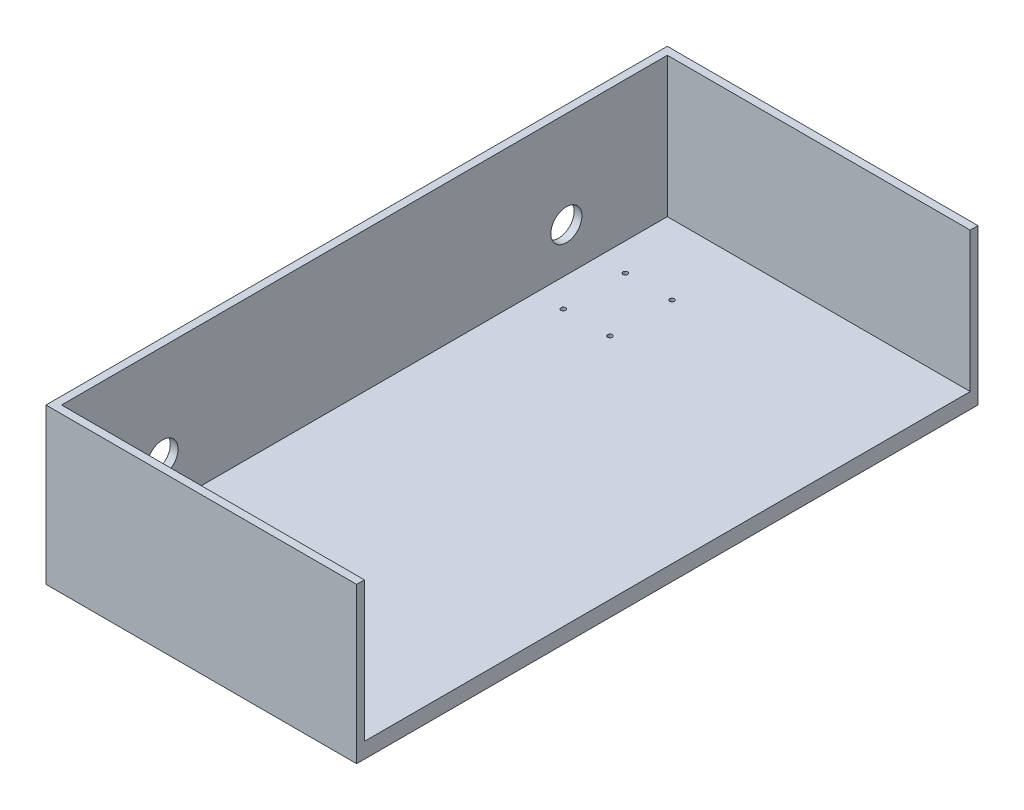
ISO-10303-21;
HEADER;
FILE_DESCRIPTION(('STEP AP214'),'2;1');
FILE_NAME('part.step','',(''),(''),'','','');
FILE_SCHEMA(('AUTOMOTIVE_DESIGN { 1 0 10303 214 1 1 1 1 }'));
ENDSEC;
DATA;
#1=APPLICATION_CONTEXT('core data for automotive mechanical design processes');
#2=APPLICATION_PROTOCOL_DEFINITION('international standard','automotive_design',2000,#1);
#3=PRODUCT_CONTEXT('',#1,'mechanical');
#4=PRODUCT('Part','Part','',(#3));
#5=PRODUCT_RELATED_PRODUCT_CATEGORY('part','',(#4));
#6=PRODUCT_DEFINITION_FORMATION('','',#4);
#7=PRODUCT_DEFINITION_CONTEXT('part definition',#1,'design');
#8=PRODUCT_DEFINITION('design','',#6,#7);
#9=PRODUCT_DEFINITION_SHAPE('','',#8);
#10=(LENGTH_UNIT() NAMED_UNIT(*) SI_UNIT(.MILLI.,.METRE.));
#11=(NAMED_UNIT(*) PLANE_ANGLE_UNIT() SI_UNIT($,.RADIAN.));
#12=(NAMED_UNIT(*) SI_UNIT($,.STERADIAN.) SOLID_ANGLE_UNIT());
#13=UNCERTAINTY_MEASURE_WITH_UNIT(LENGTH_MEASURE(1.E-05),#10,'distance_accuracy_value','');
#14=(GEOMETRIC_REPRESENTATION_CONTEXT(3) GLOBAL_UNCERTAINTY_ASSIGNED_CONTEXT((#13)) GLOBAL_UNIT_ASSIGNED_CONTEXT((#10,
#11,#12)) REPRESENTATION_CONTEXT('',''));
#15=CARTESIAN_POINT('',(0.,0.,0.));
#16=DIRECTION('',(0.,0.,1.));
#17=DIRECTION('',(1.,0.,0.));
#18=AXIS2_PLACEMENT_3D('',#15,#16,#17);
#19=CARTESIAN_POINT('',(0.,10.,0.));
#20=DIRECTION('',(0.,-1.,0.));
#21=DIRECTION('',(0.,0.,-1.));
#22=AXIS2_PLACEMENT_3D('',#19,#20,#21);
#23=PLANE('',#22);
#24=CARTESIAN_POINT('',(53.,10.,-350.));
#25=DIRECTION('',(0.,1.,0.));
#26=DIRECTION('',(0.,0.,1.));
#27=AXIS2_PLACEMENT_3D('',#24,#25,#26);
#28=CIRCLE('',#27,1.5);
#29=CARTESIAN_POINT('',(53.,10.,-348.5));
#30=VERTEX_POINT('',#29);
#31=EDGE_CURVE('E463',#30,#30,#28,.T.);
#32=ORIENTED_EDGE('',*,*,#31,.F.);
#33=EDGE_LOOP('',(#32));
#34=FACE_BOUND('',#33,.T.);
#35=CARTESIAN_POINT('',(53.,10.,-310.));
#36=DIRECTION('',(0.,1.,0.));
#37=DIRECTION('',(0.,0.,1.));
#38=AXIS2_PLACEMENT_3D('',#35,#36,#37);
#39=CIRCLE('',#38,1.5);
#40=CARTESIAN_POINT('',(53.,10.,-308.5));
#41=VERTEX_POINT('',#40);
#42=EDGE_CURVE('E474',#41,#41,#39,.T.);
#43=ORIENTED_EDGE('',*,*,#42,.F.);
#44=EDGE_LOOP('',(#43));
#45=FACE_BOUND('',#44,.T.);
#46=CARTESIAN_POINT('',(23.,10.,-310.));
#47=DIRECTION('',(0.,1.,0.));
#48=DIRECTION('',(0.,0.,1.));
#49=AXIS2_PLACEMENT_3D('',#46,#47,#48);
#50=CIRCLE('',#49,1.5);
#51=CARTESIAN_POINT('',(23.,10.,-308.5));
#52=VERTEX_POINT('',#51);
#53=EDGE_CURVE('E480',#52,#52,#50,.T.);
#54=ORIENTED_EDGE('',*,*,#53,.F.);
#55=EDGE_LOOP('',(#54));
#56=FACE_BOUND('',#55,.T.);
#57=CARTESIAN_POINT('',(23.,10.,-90.));
#58=DIRECTION('',(0.,1.,0.));
#59=DIRECTION('',(0.,0.,-1.));
#60=AXIS2_PLACEMENT_3D('',#57,#58,#59);
#61=CIRCLE('',#60,1.5);
#62=CARTESIAN_POINT('',(23.,10.,-91.5));
#63=VERTEX_POINT('',#62);
#64=EDGE_CURVE('E486',#63,#63,#61,.T.);
#65=ORIENTED_EDGE('',*,*,#64,.F.);
#66=EDGE_LOOP('',(#65));
#67=FACE_BOUND('',#66,.T.);
#68=CARTESIAN_POINT('',(53.,10.,-90.));
#69=DIRECTION('',(0.,1.,0.));
#70=DIRECTION('',(0.,0.,-1.));
#71=AXIS2_PLACEMENT_3D('',#68,#69,#70);
#72=CIRCLE('',#71,1.5);
#73=CARTESIAN_POINT('',(53.,10.,-91.5));
#74=VERTEX_POINT('',#73);
#75=EDGE_CURVE('E492',#74,#74,#72,.T.);
#76=ORIENTED_EDGE('',*,*,#75,.F.);
#77=EDGE_LOOP('',(#76));
#78=FACE_BOUND('',#77,.T.);
#79=CARTESIAN_POINT('',(53.,10.,-50.));
#80=DIRECTION('',(0.,1.,0.));
#81=DIRECTION('',(0.,0.,-1.));
#82=AXIS2_PLACEMENT_3D('',#79,#80,#81);
#83=CIRCLE('',#82,1.5);
#84=CARTESIAN_POINT('',(53.,10.,-51.5));
#85=VERTEX_POINT('',#84);
#86=EDGE_CURVE('E498',#85,#85,#83,.T.);
#87=ORIENTED_EDGE('',*,*,#86,.F.);
#88=EDGE_LOOP('',(#87));
#89=FACE_BOUND('',#88,.T.);
#90=CARTESIAN_POINT('',(23.,10.,-50.));
#91=DIRECTION('',(0.,1.,0.));
#92=DIRECTION('',(0.,0.,-1.));
#93=AXIS2_PLACEMENT_3D('',#90,#91,#92);
#94=CIRCLE('',#93,1.5);
#95=CARTESIAN_POINT('',(23.,10.,-51.5));
#96=VERTEX_POINT('',#95);
#97=EDGE_CURVE('E504',#96,#96,#94,.T.);
#98=ORIENTED_EDGE('',*,*,#97,.F.);
#99=EDGE_LOOP('',(#98));
#100=FACE_BOUND('',#99,.T.);
#101=CARTESIAN_POINT('',(23.,10.,-350.));
#102=DIRECTION('',(0.,1.,0.));
#103=DIRECTION('',(0.,0.,1.));
#104=AXIS2_PLACEMENT_3D('',#101,#102,#103);
#105=CIRCLE('',#104,1.5);
#106=CARTESIAN_POINT('',(23.,10.,-348.5));
#107=VERTEX_POINT('',#106);
#108=EDGE_CURVE('E462',#107,#107,#105,.T.);
#109=ORIENTED_EDGE('',*,*,#108,.F.);
#110=EDGE_LOOP('',(#109));
#111=FACE_BOUND('',#110,.T.);
#112=DIRECTION('',(1.,0.,0.));
#113=VECTOR('',#112,1.);
#114=CARTESIAN_POINT('',(5.,10.,-395.));
#115=LINE('',#114,#113);
#116=CARTESIAN_POINT('',(5.,10.,-395.));
#117=VERTEX_POINT('',#116);
#118=CARTESIAN_POINT('',(200.,10.,-395.));
#119=VERTEX_POINT('',#118);
#120=EDGE_CURVE('E48',#117,#119,#115,.T.);
#121=ORIENTED_EDGE('',*,*,#120,.F.);
#122=DIRECTION('',(0.,0.,-1.));
#123=VECTOR('',#122,1.);
#124=CARTESIAN_POINT('',(5.00000000000005,10.,-5.));
#125=LINE('',#124,#123);
#126=CARTESIAN_POINT('',(5.00000000000005,10.,-5.));
#127=VERTEX_POINT('',#126);
#128=EDGE_CURVE('E116',#127,#117,#125,.T.);
#129=ORIENTED_EDGE('',*,*,#128,.F.);
#130=DIRECTION('',(-1.,0.,0.));
#131=VECTOR('',#130,1.);
#132=CARTESIAN_POINT('',(5.00000000000005,10.,-5.));
#133=LINE('',#132,#131);
#134=CARTESIAN_POINT('',(200.,10.,-5.));
#135=VERTEX_POINT('',#134);
#136=EDGE_CURVE('E168',#135,#127,#133,.T.);
#137=ORIENTED_EDGE('',*,*,#136,.F.);
#138=DIRECTION('',(0.,0.,-1.));
#139=VECTOR('',#138,1.);
#140=CARTESIAN_POINT('',(200.,10.,0.));
#141=LINE('',#140,#139);
#142=EDGE_CURVE('E53',#135,#119,#141,.T.);
#143=ORIENTED_EDGE('',*,*,#142,.T.);
#144=EDGE_LOOP('',(#121,#129,#137,#143));
#145=FACE_BOUND('',#144,.T.);
#146=ADVANCED_FACE('F33',(#34,#45,#56,#67,#78,#89,#100,#111,#145),#23,.F.);
#147=CARTESIAN_POINT('',(0.,10.,0.));
#148=DIRECTION('',(1.,0.,0.));
#149=DIRECTION('',(0.,0.,-1.));
#150=AXIS2_PLACEMENT_3D('',#147,#148,#149);
#151=PLANE('',#150);
#152=CARTESIAN_POINT('',(0.,38.,-330.));
#153=DIRECTION('',(1.,0.,0.));
#154=DIRECTION('',(0.,0.,-1.));
#155=AXIS2_PLACEMENT_3D('',#152,#153,#154);
#156=CIRCLE('',#155,9.99999999999998);
#157=CARTESIAN_POINT('',(0.,38.,-340.));
#158=VERTEX_POINT('',#157);
#159=EDGE_CURVE('E512',#158,#158,#156,.F.);
#160=ORIENTED_EDGE('',*,*,#159,.F.);
#161=EDGE_LOOP('',(#160));
#162=FACE_BOUND('',#161,.T.);
#163=CARTESIAN_POINT('',(0.,38.,-70.));
#164=DIRECTION('',(1.,0.,0.));
#165=DIRECTION('',(0.,0.,-1.));
#166=AXIS2_PLACEMENT_3D('',#163,#164,#165);
#167=CIRCLE('',#166,10.);
#168=CARTESIAN_POINT('',(0.,38.,-80.));
#169=VERTEX_POINT('',#168);
#170=EDGE_CURVE('E169',#169,#169,#167,.F.);
#171=ORIENTED_EDGE('',*,*,#170,.F.);
#172=EDGE_LOOP('',(#171));
#173=FACE_BOUND('',#172,.T.);
#174=DIRECTION('',(0.,0.,1.));
#175=VECTOR('',#174,1.);
#176=CARTESIAN_POINT('',(0.,0.,0.));
#177=LINE('',#176,#175);
#178=CARTESIAN_POINT('',(0.,0.,-400.));
#179=VERTEX_POINT('',#178);
#180=CARTESIAN_POINT('',(0.,0.,0.));
#181=VERTEX_POINT('',#180);
#182=EDGE_CURVE('E119',#179,#181,#177,.T.);
#183=ORIENTED_EDGE('',*,*,#182,.T.);
#184=DIRECTION('',(0.,-1.,0.));
#185=VECTOR('',#184,1.);
#186=CARTESIAN_POINT('',(0.,10.,0.));
#187=LINE('',#186,#185);
#188=CARTESIAN_POINT('',(0.,100.,0.));
#189=VERTEX_POINT('',#188);
#190=EDGE_CURVE('E11',#189,#181,#187,.T.);
#191=ORIENTED_EDGE('',*,*,#190,.F.);
#192=DIRECTION('',(0.,0.,1.));
#193=VECTOR('',#192,1.);
#194=CARTESIAN_POINT('',(0.,100.,0.));
#195=LINE('',#194,#193);
#196=CARTESIAN_POINT('',(0.,100.,-400.));
#197=VERTEX_POINT('',#196);
#198=EDGE_CURVE('E156',#197,#189,#195,.T.);
#199=ORIENTED_EDGE('',*,*,#198,.F.);
#200=DIRECTION('',(0.,-1.,0.));
#201=VECTOR('',#200,1.);
#202=CARTESIAN_POINT('',(0.,10.,-400.));
#203=LINE('',#202,#201);
#204=EDGE_CURVE('E130',#197,#179,#203,.T.);
#205=ORIENTED_EDGE('',*,*,#204,.T.);
#206=EDGE_LOOP('',(#183,#191,#199,#205));
#207=FACE_BOUND('',#206,.T.);
#208=ADVANCED_FACE('F35',(#162,#173,#207),#151,.F.);
#209=CARTESIAN_POINT('',(0.,10.,0.));
#210=DIRECTION('',(0.,0.,-1.));
#211=DIRECTION('',(-1.,0.,0.));
#212=AXIS2_PLACEMENT_3D('',#209,#210,#211);
#213=PLANE('',#212);
#214=DIRECTION('',(1.,0.,0.));
#215=VECTOR('',#214,1.);
#216=CARTESIAN_POINT('',(0.,0.,0.));
#217=LINE('',#216,#215);
#218=CARTESIAN_POINT('',(200.,0.,0.));
#219=VERTEX_POINT('',#218);
#220=EDGE_CURVE('E123',#181,#219,#217,.T.);
#221=ORIENTED_EDGE('',*,*,#220,.T.);
#222=DIRECTION('',(0.,-1.,0.));
#223=VECTOR('',#222,1.);
#224=CARTESIAN_POINT('',(200.,10.,0.));
#225=LINE('',#224,#223);
#226=CARTESIAN_POINT('',(200.,100.,0.));
#227=VERTEX_POINT('',#226);
#228=EDGE_CURVE('E41',#227,#219,#225,.T.);
#229=ORIENTED_EDGE('',*,*,#228,.F.);
#230=DIRECTION('',(1.,0.,0.));
#231=VECTOR('',#230,1.);
#232=CARTESIAN_POINT('',(200.,100.,0.));
#233=LINE('',#232,#231);
#234=EDGE_CURVE('E157',#189,#227,#233,.T.);
#235=ORIENTED_EDGE('',*,*,#234,.F.);
#236=ORIENTED_EDGE('',*,*,#190,.T.);
#237=EDGE_LOOP('',(#221,#229,#235,#236));
#238=FACE_BOUND('',#237,.T.);
#239=ADVANCED_FACE('F186',(#238),#213,.F.);
#240=CARTESIAN_POINT('',(200.,10.,0.));
#241=DIRECTION('',(-1.,0.,0.));
#242=DIRECTION('',(0.,0.,1.));
#243=AXIS2_PLACEMENT_3D('',#240,#241,#242);
#244=PLANE('',#243);
#245=DIRECTION('',(0.,0.,-1.));
#246=VECTOR('',#245,1.);
#247=CARTESIAN_POINT('',(200.,0.,0.));
#248=LINE('',#247,#246);
#249=CARTESIAN_POINT('',(200.,0.,-400.));
#250=VERTEX_POINT('',#249);
#251=EDGE_CURVE('E134',#219,#250,#248,.T.);
#252=ORIENTED_EDGE('',*,*,#251,.T.);
#253=DIRECTION('',(0.,-1.,0.));
#254=VECTOR('',#253,1.);
#255=CARTESIAN_POINT('',(200.,10.,-400.));
#256=LINE('',#255,#254);
#257=CARTESIAN_POINT('',(200.,100.,-400.));
#258=VERTEX_POINT('',#257);
#259=EDGE_CURVE('E102',#258,#250,#256,.T.);
#260=ORIENTED_EDGE('',*,*,#259,.F.);
#261=DIRECTION('',(0.,0.,-1.));
#262=VECTOR('',#261,1.);
#263=CARTESIAN_POINT('',(200.,100.,-400.));
#264=LINE('',#263,#262);
#265=CARTESIAN_POINT('',(200.,100.,-395.));
#266=VERTEX_POINT('',#265);
#267=EDGE_CURVE('E96',#266,#258,#264,.T.);
#268=ORIENTED_EDGE('',*,*,#267,.F.);
#269=DIRECTION('',(0.,-1.,0.));
#270=VECTOR('',#269,1.);
#271=CARTESIAN_POINT('',(200.,100.,-395.));
#272=LINE('',#271,#270);
#273=EDGE_CURVE('E100',#266,#119,#272,.T.);
#274=ORIENTED_EDGE('',*,*,#273,.T.);
#275=ORIENTED_EDGE('',*,*,#142,.F.);
#276=DIRECTION('',(0.,-1.,0.));
#277=VECTOR('',#276,1.);
#278=CARTESIAN_POINT('',(200.,100.,-5.));
#279=LINE('',#278,#277);
#280=CARTESIAN_POINT('',(200.,100.,-5.));
#281=VERTEX_POINT('',#280);
#282=EDGE_CURVE('E120',#281,#135,#279,.T.);
#283=ORIENTED_EDGE('',*,*,#282,.F.);
#284=DIRECTION('',(0.,0.,-1.));
#285=VECTOR('',#284,1.);
#286=CARTESIAN_POINT('',(200.,100.,-5.));
#287=LINE('',#286,#285);
#288=EDGE_CURVE('E143',#227,#281,#287,.T.);
#289=ORIENTED_EDGE('',*,*,#288,.F.);
#290=ORIENTED_EDGE('',*,*,#228,.T.);
#291=EDGE_LOOP('',(#252,#260,#268,#274,#275,#283,#289,#290));
#292=FACE_BOUND('',#291,.T.);
#293=ADVANCED_FACE('F98',(#292),#244,.F.);
#294=CARTESIAN_POINT('',(0.,10.,-400.));
#295=DIRECTION('',(0.,0.,1.));
#296=DIRECTION('',(1.,0.,0.));
#297=AXIS2_PLACEMENT_3D('',#294,#295,#296);
#298=PLANE('',#297);
#299=DIRECTION('',(-1.,0.,0.));
#300=VECTOR('',#299,1.);
#301=CARTESIAN_POINT('',(0.,0.,-400.));
#302=LINE('',#301,#300);
#303=EDGE_CURVE('E131',#250,#179,#302,.T.);
#304=ORIENTED_EDGE('',*,*,#303,.T.);
#305=ORIENTED_EDGE('',*,*,#204,.F.);
#306=DIRECTION('',(-1.,0.,0.));
#307=VECTOR('',#306,1.);
#308=CARTESIAN_POINT('',(0.,100.,-400.));
#309=LINE('',#308,#307);
#310=EDGE_CURVE('E106',#258,#197,#309,.T.);
#311=ORIENTED_EDGE('',*,*,#310,.F.);
#312=ORIENTED_EDGE('',*,*,#259,.T.);
#313=EDGE_LOOP('',(#304,#305,#311,#312));
#314=FACE_BOUND('',#313,.T.);
#315=ADVANCED_FACE('F152',(#314),#298,.F.);
#316=CARTESIAN_POINT('',(0.,0.,0.));
#317=DIRECTION('',(0.,-1.,0.));
#318=DIRECTION('',(0.,0.,-1.));
#319=AXIS2_PLACEMENT_3D('',#316,#317,#318);
#320=PLANE('',#319);
#321=ORIENTED_EDGE('',*,*,#182,.F.);
#322=ORIENTED_EDGE('',*,*,#303,.F.);
#323=ORIENTED_EDGE('',*,*,#251,.F.);
#324=ORIENTED_EDGE('',*,*,#220,.F.);
#325=EDGE_LOOP('',(#321,#322,#323,#324));
#326=FACE_BOUND('',#325,.T.);
#327=ADVANCED_FACE('F150',(#326),#320,.T.);
#328=CARTESIAN_POINT('',(5.,100.,-395.));
#329=DIRECTION('',(0.,0.,-1.));
#330=DIRECTION('',(-1.,0.,0.));
#331=AXIS2_PLACEMENT_3D('',#328,#329,#330);
#332=PLANE('',#331);
#333=ORIENTED_EDGE('',*,*,#120,.T.);
#334=ORIENTED_EDGE('',*,*,#273,.F.);
#335=DIRECTION('',(1.,0.,0.));
#336=VECTOR('',#335,1.);
#337=CARTESIAN_POINT('',(5.,100.,-395.));
#338=LINE('',#337,#336);
#339=CARTESIAN_POINT('',(5.,100.,-395.));
#340=VERTEX_POINT('',#339);
#341=EDGE_CURVE('E107',#340,#266,#338,.T.);
#342=ORIENTED_EDGE('',*,*,#341,.F.);
#343=DIRECTION('',(0.,-1.,0.));
#344=VECTOR('',#343,1.);
#345=CARTESIAN_POINT('',(5.,100.,-395.));
#346=LINE('',#345,#344);
#347=EDGE_CURVE('E166',#340,#117,#346,.T.);
#348=ORIENTED_EDGE('',*,*,#347,.T.);
#349=EDGE_LOOP('',(#333,#334,#342,#348));
#350=FACE_BOUND('',#349,.T.);
#351=ADVANCED_FACE('F118',(#350),#332,.F.);
#352=CARTESIAN_POINT('',(5.00000000000005,100.,-5.));
#353=DIRECTION('',(0.,0.,1.));
#354=DIRECTION('',(1.,0.,0.));
#355=AXIS2_PLACEMENT_3D('',#352,#353,#354);
#356=PLANE('',#355);
#357=ORIENTED_EDGE('',*,*,#136,.T.);
#358=DIRECTION('',(0.,-1.,0.));
#359=VECTOR('',#358,1.);
#360=CARTESIAN_POINT('',(5.00000000000005,100.,-5.));
#361=LINE('',#360,#359);
#362=CARTESIAN_POINT('',(5.00000000000005,100.,-5.));
#363=VERTEX_POINT('',#362);
#364=EDGE_CURVE('E126',#363,#127,#361,.T.);
#365=ORIENTED_EDGE('',*,*,#364,.F.);
#366=DIRECTION('',(-1.,0.,0.));
#367=VECTOR('',#366,1.);
#368=CARTESIAN_POINT('',(5.00000000000005,100.,-5.));
#369=LINE('',#368,#367);
#370=EDGE_CURVE('E163',#281,#363,#369,.T.);
#371=ORIENTED_EDGE('',*,*,#370,.F.);
#372=ORIENTED_EDGE('',*,*,#282,.T.);
#373=EDGE_LOOP('',(#357,#365,#371,#372));
#374=FACE_BOUND('',#373,.T.);
#375=ADVANCED_FACE('F179',(#374),#356,.F.);
#376=CARTESIAN_POINT('',(5.00000000000005,100.,-5.));
#377=DIRECTION('',(-1.,0.,0.));
#378=DIRECTION('',(0.,0.,1.));
#379=AXIS2_PLACEMENT_3D('',#376,#377,#378);
#380=PLANE('',#379);
#381=CARTESIAN_POINT('',(5.00000000000001,38.,-330.));
#382=DIRECTION('',(1.,0.,0.));
#383=DIRECTION('',(0.,0.,-1.));
#384=AXIS2_PLACEMENT_3D('',#381,#382,#383);
#385=CIRCLE('',#384,9.99999999999998);
#386=CARTESIAN_POINT('',(5.00000000000001,38.,-340.));
#387=VERTEX_POINT('',#386);
#388=EDGE_CURVE('E508',#387,#387,#385,.T.);
#389=ORIENTED_EDGE('',*,*,#388,.F.);
#390=EDGE_LOOP('',(#389));
#391=FACE_BOUND('',#390,.T.);
#392=CARTESIAN_POINT('',(5.00000000000004,38.,-70.));
#393=DIRECTION('',(1.,0.,0.));
#394=DIRECTION('',(0.,0.,-1.));
#395=AXIS2_PLACEMENT_3D('',#392,#393,#394);
#396=CIRCLE('',#395,10.);
#397=CARTESIAN_POINT('',(5.00000000000004,38.,-80.));
#398=VERTEX_POINT('',#397);
#399=EDGE_CURVE('E515',#398,#398,#396,.T.);
#400=ORIENTED_EDGE('',*,*,#399,.F.);
#401=EDGE_LOOP('',(#400));
#402=FACE_BOUND('',#401,.T.);
#403=ORIENTED_EDGE('',*,*,#128,.T.);
#404=ORIENTED_EDGE('',*,*,#347,.F.);
#405=DIRECTION('',(0.,0.,-1.));
#406=VECTOR('',#405,1.);
#407=CARTESIAN_POINT('',(5.00000000000005,100.,-5.));
#408=LINE('',#407,#406);
#409=EDGE_CURVE('E112',#363,#340,#408,.T.);
#410=ORIENTED_EDGE('',*,*,#409,.F.);
#411=ORIENTED_EDGE('',*,*,#364,.T.);
#412=EDGE_LOOP('',(#403,#404,#410,#411));
#413=FACE_BOUND('',#412,.T.);
#414=ADVANCED_FACE('F176',(#391,#402,#413),#380,.F.);
#415=CARTESIAN_POINT('',(0.,100.,0.));
#416=DIRECTION('',(0.,-1.,0.));
#417=DIRECTION('',(0.,0.,-1.));
#418=AXIS2_PLACEMENT_3D('',#415,#416,#417);
#419=PLANE('',#418);
#420=ORIENTED_EDGE('',*,*,#341,.T.);
#421=ORIENTED_EDGE('',*,*,#267,.T.);
#422=ORIENTED_EDGE('',*,*,#310,.T.);
#423=ORIENTED_EDGE('',*,*,#198,.T.);
#424=ORIENTED_EDGE('',*,*,#234,.T.);
#425=ORIENTED_EDGE('',*,*,#288,.T.);
#426=ORIENTED_EDGE('',*,*,#370,.T.);
#427=ORIENTED_EDGE('',*,*,#409,.T.);
#428=EDGE_LOOP('',(#420,#421,#422,#423,#424,#425,#426,#427));
#429=FACE_BOUND('',#428,.T.);
#430=ADVANCED_FACE('F110',(#429),#419,.F.);
#431=CARTESIAN_POINT('',(-0.00100000000000881,38.,-70.));
#432=DIRECTION('',(1.,0.,0.));
#433=DIRECTION('',(0.,0.,-1.));
#434=AXIS2_PLACEMENT_3D('',#431,#432,#433);
#435=CYLINDRICAL_SURFACE('',#434,10.);
#436=ORIENTED_EDGE('',*,*,#399,.T.);
#437=EDGE_LOOP('',(#436));
#438=FACE_BOUND('',#437,.T.);
#439=ORIENTED_EDGE('',*,*,#170,.T.);
#440=EDGE_LOOP('',(#439));
#441=FACE_BOUND('',#440,.T.);
#442=ADVANCED_FACE('F239',(#438,#441),#435,.F.);
#443=CARTESIAN_POINT('',(-0.0010000000000409,38.,-330.));
#444=DIRECTION('',(1.,0.,0.));
#445=DIRECTION('',(0.,0.,-1.));
#446=AXIS2_PLACEMENT_3D('',#443,#444,#445);
#447=CYLINDRICAL_SURFACE('',#446,9.99999999999998);
#448=ORIENTED_EDGE('',*,*,#388,.T.);
#449=EDGE_LOOP('',(#448));
#450=FACE_BOUND('',#449,.T.);
#451=ORIENTED_EDGE('',*,*,#159,.T.);
#452=EDGE_LOOP('',(#451));
#453=FACE_BOUND('',#452,.T.);
#454=ADVANCED_FACE('F245',(#450,#453),#447,.F.);
#455=CARTESIAN_POINT('',(23.,5.,-350.));
#456=DIRECTION('',(0.,1.,0.));
#457=DIRECTION('',(0.,0.,1.));
#458=AXIS2_PLACEMENT_3D('',#455,#456,#457);
#459=CYLINDRICAL_SURFACE('',#458,1.5);
#460=CARTESIAN_POINT('',(23.,5.,-350.));
#461=DIRECTION('',(0.,1.,0.));
#462=DIRECTION('',(0.,0.,1.));
#463=AXIS2_PLACEMENT_3D('',#460,#461,#462);
#464=CIRCLE('',#463,1.5);
#465=CARTESIAN_POINT('',(23.,5.,-348.5));
#466=VERTEX_POINT('',#465);
#467=EDGE_CURVE('E466',#466,#466,#464,.T.);
#468=ORIENTED_EDGE('',*,*,#467,.F.);
#469=EDGE_LOOP('',(#468));
#470=FACE_BOUND('',#469,.T.);
#471=ORIENTED_EDGE('',*,*,#108,.T.);
#472=EDGE_LOOP('',(#471));
#473=FACE_BOUND('',#472,.T.);
#474=ADVANCED_FACE('F253',(#470,#473),#459,.F.);
#475=CARTESIAN_POINT('',(23.,5.,-350.));
#476=DIRECTION('',(0.,1.,0.));
#477=DIRECTION('',(0.,0.,1.));
#478=AXIS2_PLACEMENT_3D('',#475,#476,#477);
#479=PLANE('',#478);
#480=ORIENTED_EDGE('',*,*,#467,.T.);
#481=EDGE_LOOP('',(#480));
#482=FACE_BOUND('',#481,.T.);
#483=ADVANCED_FACE('F261',(#482),#479,.T.);
#484=CARTESIAN_POINT('',(23.,5.,-50.));
#485=DIRECTION('',(0.,1.,0.));
#486=DIRECTION('',(0.,0.,1.));
#487=AXIS2_PLACEMENT_3D('',#484,#485,#486);
#488=CYLINDRICAL_SURFACE('',#487,1.5);
#489=CARTESIAN_POINT('',(23.,5.,-50.));
#490=DIRECTION('',(0.,1.,0.));
#491=DIRECTION('',(0.,0.,-1.));
#492=AXIS2_PLACEMENT_3D('',#489,#490,#491);
#493=CIRCLE('',#492,1.5);
#494=CARTESIAN_POINT('',(23.,5.,-51.5));
#495=VERTEX_POINT('',#494);
#496=EDGE_CURVE('E501',#495,#495,#493,.T.);
#497=ORIENTED_EDGE('',*,*,#496,.F.);
#498=EDGE_LOOP('',(#497));
#499=FACE_BOUND('',#498,.T.);
#500=ORIENTED_EDGE('',*,*,#97,.T.);
#501=EDGE_LOOP('',(#500));
#502=FACE_BOUND('',#501,.T.);
#503=ADVANCED_FACE('F269',(#499,#502),#488,.F.);
#504=CARTESIAN_POINT('',(23.,5.,-50.));
#505=DIRECTION('',(0.,-1.,0.));
#506=DIRECTION('',(0.,0.,-1.));
#507=AXIS2_PLACEMENT_3D('',#504,#505,#506);
#508=PLANE('',#507);
#509=ORIENTED_EDGE('',*,*,#496,.T.);
#510=EDGE_LOOP('',(#509));
#511=FACE_BOUND('',#510,.T.);
#512=ADVANCED_FACE('F277',(#511),#508,.F.);
#513=CARTESIAN_POINT('',(53.,5.,-50.));
#514=DIRECTION('',(0.,1.,0.));
#515=DIRECTION('',(0.,0.,1.));
#516=AXIS2_PLACEMENT_3D('',#513,#514,#515);
#517=CYLINDRICAL_SURFACE('',#516,1.5);
#518=CARTESIAN_POINT('',(53.,5.,-50.));
#519=DIRECTION('',(0.,1.,0.));
#520=DIRECTION('',(0.,0.,-1.));
#521=AXIS2_PLACEMENT_3D('',#518,#519,#520);
#522=CIRCLE('',#521,1.5);
#523=CARTESIAN_POINT('',(53.,5.,-51.5));
#524=VERTEX_POINT('',#523);
#525=EDGE_CURVE('E495',#524,#524,#522,.T.);
#526=ORIENTED_EDGE('',*,*,#525,.F.);
#527=EDGE_LOOP('',(#526));
#528=FACE_BOUND('',#527,.T.);
#529=ORIENTED_EDGE('',*,*,#86,.T.);
#530=EDGE_LOOP('',(#529));
#531=FACE_BOUND('',#530,.T.);
#532=ADVANCED_FACE('F285',(#528,#531),#517,.F.);
#533=CARTESIAN_POINT('',(53.,5.,-50.));
#534=DIRECTION('',(0.,-1.,0.));
#535=DIRECTION('',(0.,0.,-1.));
#536=AXIS2_PLACEMENT_3D('',#533,#534,#535);
#537=PLANE('',#536);
#538=ORIENTED_EDGE('',*,*,#525,.T.);
#539=EDGE_LOOP('',(#538));
#540=FACE_BOUND('',#539,.T.);
#541=ADVANCED_FACE('F293',(#540),#537,.F.);
#542=CARTESIAN_POINT('',(53.,5.,-90.));
#543=DIRECTION('',(0.,1.,0.));
#544=DIRECTION('',(0.,0.,1.));
#545=AXIS2_PLACEMENT_3D('',#542,#543,#544);
#546=CYLINDRICAL_SURFACE('',#545,1.5);
#547=CARTESIAN_POINT('',(53.,5.,-90.));
#548=DIRECTION('',(0.,1.,0.));
#549=DIRECTION('',(0.,0.,-1.));
#550=AXIS2_PLACEMENT_3D('',#547,#548,#549);
#551=CIRCLE('',#550,1.5);
#552=CARTESIAN_POINT('',(53.,5.,-91.5));
#553=VERTEX_POINT('',#552);
#554=EDGE_CURVE('E489',#553,#553,#551,.T.);
#555=ORIENTED_EDGE('',*,*,#554,.F.);
#556=EDGE_LOOP('',(#555));
#557=FACE_BOUND('',#556,.T.);
#558=ORIENTED_EDGE('',*,*,#75,.T.);
#559=EDGE_LOOP('',(#558));
#560=FACE_BOUND('',#559,.T.);
#561=ADVANCED_FACE('F301',(#557,#560),#546,.F.);
#562=CARTESIAN_POINT('',(53.,5.,-90.));
#563=DIRECTION('',(0.,-1.,0.));
#564=DIRECTION('',(0.,0.,-1.));
#565=AXIS2_PLACEMENT_3D('',#562,#563,#564);
#566=PLANE('',#565);
#567=ORIENTED_EDGE('',*,*,#554,.T.);
#568=EDGE_LOOP('',(#567));
#569=FACE_BOUND('',#568,.T.);
#570=ADVANCED_FACE('F309',(#569),#566,.F.);
#571=CARTESIAN_POINT('',(23.,5.,-90.));
#572=DIRECTION('',(0.,1.,0.));
#573=DIRECTION('',(0.,0.,1.));
#574=AXIS2_PLACEMENT_3D('',#571,#572,#573);
#575=CYLINDRICAL_SURFACE('',#574,1.5);
#576=CARTESIAN_POINT('',(23.,5.,-90.));
#577=DIRECTION('',(0.,1.,0.));
#578=DIRECTION('',(0.,0.,-1.));
#579=AXIS2_PLACEMENT_3D('',#576,#577,#578);
#580=CIRCLE('',#579,1.5);
#581=CARTESIAN_POINT('',(23.,5.,-91.5));
#582=VERTEX_POINT('',#581);
#583=EDGE_CURVE('E483',#582,#582,#580,.T.);
#584=ORIENTED_EDGE('',*,*,#583,.F.);
#585=EDGE_LOOP('',(#584));
#586=FACE_BOUND('',#585,.T.);
#587=ORIENTED_EDGE('',*,*,#64,.T.);
#588=EDGE_LOOP('',(#587));
#589=FACE_BOUND('',#588,.T.);
#590=ADVANCED_FACE('F317',(#586,#589),#575,.F.);
#591=CARTESIAN_POINT('',(23.,5.,-90.));
#592=DIRECTION('',(0.,-1.,0.));
#593=DIRECTION('',(0.,0.,-1.));
#594=AXIS2_PLACEMENT_3D('',#591,#592,#593);
#595=PLANE('',#594);
#596=ORIENTED_EDGE('',*,*,#583,.T.);
#597=EDGE_LOOP('',(#596));
#598=FACE_BOUND('',#597,.T.);
#599=ADVANCED_FACE('F325',(#598),#595,.F.);
#600=CARTESIAN_POINT('',(23.,5.,-310.));
#601=DIRECTION('',(0.,1.,0.));
#602=DIRECTION('',(0.,0.,1.));
#603=AXIS2_PLACEMENT_3D('',#600,#601,#602);
#604=CYLINDRICAL_SURFACE('',#603,1.5);
#605=CARTESIAN_POINT('',(23.,5.,-310.));
#606=DIRECTION('',(0.,1.,0.));
#607=DIRECTION('',(0.,0.,1.));
#608=AXIS2_PLACEMENT_3D('',#605,#606,#607);
#609=CIRCLE('',#608,1.5);
#610=CARTESIAN_POINT('',(23.,5.,-308.5));
#611=VERTEX_POINT('',#610);
#612=EDGE_CURVE('E477',#611,#611,#609,.T.);
#613=ORIENTED_EDGE('',*,*,#612,.F.);
#614=EDGE_LOOP('',(#613));
#615=FACE_BOUND('',#614,.T.);
#616=ORIENTED_EDGE('',*,*,#53,.T.);
#617=EDGE_LOOP('',(#616));
#618=FACE_BOUND('',#617,.T.);
#619=ADVANCED_FACE('F333',(#615,#618),#604,.F.);
#620=CARTESIAN_POINT('',(23.,5.,-310.));
#621=DIRECTION('',(0.,1.,0.));
#622=DIRECTION('',(0.,0.,1.));
#623=AXIS2_PLACEMENT_3D('',#620,#621,#622);
#624=PLANE('',#623);
#625=ORIENTED_EDGE('',*,*,#612,.T.);
#626=EDGE_LOOP('',(#625));
#627=FACE_BOUND('',#626,.T.);
#628=ADVANCED_FACE('F341',(#627),#624,.T.);
#629=CARTESIAN_POINT('',(53.,5.,-310.));
#630=DIRECTION('',(0.,1.,0.));
#631=DIRECTION('',(0.,0.,1.));
#632=AXIS2_PLACEMENT_3D('',#629,#630,#631);
#633=CYLINDRICAL_SURFACE('',#632,1.5);
#634=CARTESIAN_POINT('',(53.,5.,-310.));
#635=DIRECTION('',(0.,1.,0.));
#636=DIRECTION('',(0.,0.,1.));
#637=AXIS2_PLACEMENT_3D('',#634,#635,#636);
#638=CIRCLE('',#637,1.5);
#639=CARTESIAN_POINT('',(53.,5.,-308.5));
#640=VERTEX_POINT('',#639);
#641=EDGE_CURVE('E469',#640,#640,#638,.T.);
#642=ORIENTED_EDGE('',*,*,#641,.F.);
#643=EDGE_LOOP('',(#642));
#644=FACE_BOUND('',#643,.T.);
#645=ORIENTED_EDGE('',*,*,#42,.T.);
#646=EDGE_LOOP('',(#645));
#647=FACE_BOUND('',#646,.T.);
#648=ADVANCED_FACE('F349',(#644,#647),#633,.F.);
#649=CARTESIAN_POINT('',(53.,5.,-310.));
#650=DIRECTION('',(0.,1.,0.));
#651=DIRECTION('',(0.,0.,1.));
#652=AXIS2_PLACEMENT_3D('',#649,#650,#651);
#653=PLANE('',#652);
#654=ORIENTED_EDGE('',*,*,#641,.T.);
#655=EDGE_LOOP('',(#654));
#656=FACE_BOUND('',#655,.T.);
#657=ADVANCED_FACE('F357',(#656),#653,.T.);
#658=CARTESIAN_POINT('',(53.,5.,-350.));
#659=DIRECTION('',(0.,1.,0.));
#660=DIRECTION('',(0.,0.,1.));
#661=AXIS2_PLACEMENT_3D('',#658,#659,#660);
#662=CYLINDRICAL_SURFACE('',#661,1.5);
#663=CARTESIAN_POINT('',(53.,5.,-350.));
#664=DIRECTION('',(0.,1.,0.));
#665=DIRECTION('',(0.,0.,1.));
#666=AXIS2_PLACEMENT_3D('',#663,#664,#665);
#667=CIRCLE('',#666,1.5);
#668=CARTESIAN_POINT('',(53.,5.,-348.5));
#669=VERTEX_POINT('',#668);
#670=EDGE_CURVE('E461',#669,#669,#667,.T.);
#671=ORIENTED_EDGE('',*,*,#670,.F.);
#672=EDGE_LOOP('',(#671));
#673=FACE_BOUND('',#672,.T.);
#674=ORIENTED_EDGE('',*,*,#31,.T.);
#675=EDGE_LOOP('',(#674));
#676=FACE_BOUND('',#675,.T.);
#677=ADVANCED_FACE('F365',(#673,#676),#662,.F.);
#678=CARTESIAN_POINT('',(53.,5.,-350.));
#679=DIRECTION('',(0.,1.,0.));
#680=DIRECTION('',(0.,0.,1.));
#681=AXIS2_PLACEMENT_3D('',#678,#679,#680);
#682=PLANE('',#681);
#683=ORIENTED_EDGE('',*,*,#670,.T.);
#684=EDGE_LOOP('',(#683));
#685=FACE_BOUND('',#684,.T.);
#686=ADVANCED_FACE('F373',(#685),#682,.T.);
#687=CLOSED_SHELL('',(#146,#208,#239,#293,#315,#327,#351,#375,#414,#430,#442,#454,#474,#483,
#503,#512,#532,#541,#561,#570,#590,#599,#619,#628,#648,#657,#677,#686));
#688=MANIFOLD_SOLID_BREP('B2',#687);
#689=ADVANCED_BREP_SHAPE_REPRESENTATION('',(#18,#688),#14);
#690=SHAPE_DEFINITION_REPRESENTATION(#9,#689);
ENDSEC;
END-ISO-10303-21;
